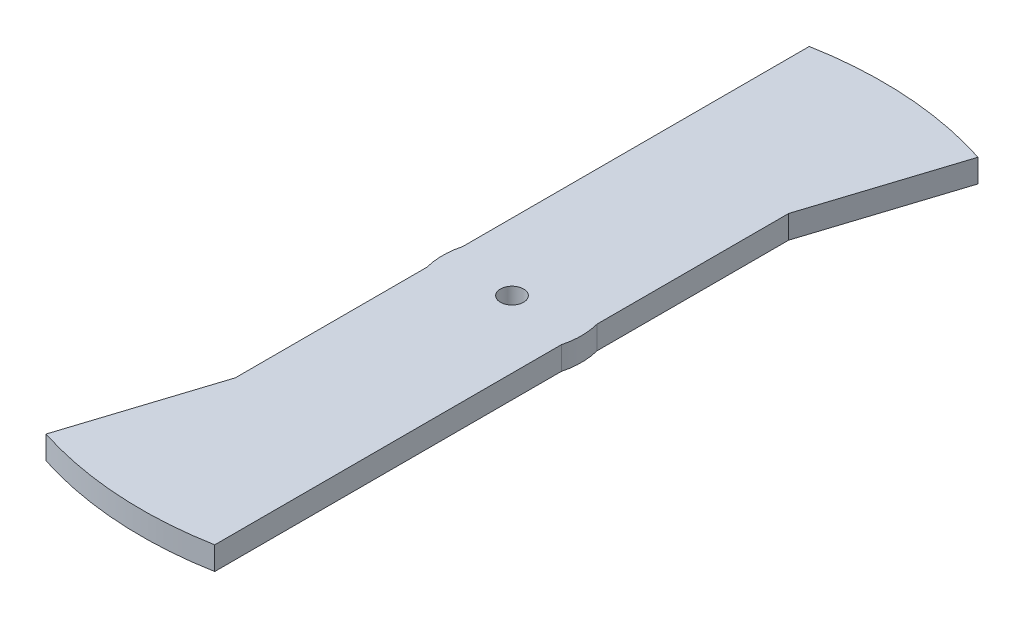
ISO-10303-21;
HEADER;
FILE_DESCRIPTION(('STEP AP214'),'2;1');
FILE_NAME('part.step','',(''),(''),'','','');
FILE_SCHEMA(('AUTOMOTIVE_DESIGN { 1 0 10303 214 1 1 1 1 }'));
ENDSEC;
DATA;
#1=APPLICATION_CONTEXT('core data for automotive mechanical design processes');
#2=APPLICATION_PROTOCOL_DEFINITION('international standard','automotive_design',2000,#1);
#3=PRODUCT_CONTEXT('',#1,'mechanical');
#4=PRODUCT('Part','Part','',(#3));
#5=PRODUCT_RELATED_PRODUCT_CATEGORY('part','',(#4));
#6=PRODUCT_DEFINITION_FORMATION('','',#4);
#7=PRODUCT_DEFINITION_CONTEXT('part definition',#1,'design');
#8=PRODUCT_DEFINITION('design','',#6,#7);
#9=PRODUCT_DEFINITION_SHAPE('','',#8);
#10=(LENGTH_UNIT() NAMED_UNIT(*) SI_UNIT(.MILLI.,.METRE.));
#11=(NAMED_UNIT(*) PLANE_ANGLE_UNIT() SI_UNIT($,.RADIAN.));
#12=(NAMED_UNIT(*) SI_UNIT($,.STERADIAN.) SOLID_ANGLE_UNIT());
#13=UNCERTAINTY_MEASURE_WITH_UNIT(LENGTH_MEASURE(1.E-05),#10,'distance_accuracy_value','');
#14=(GEOMETRIC_REPRESENTATION_CONTEXT(3) GLOBAL_UNCERTAINTY_ASSIGNED_CONTEXT((#13)) GLOBAL_UNIT_ASSIGNED_CONTEXT((#10,
#11,#12)) REPRESENTATION_CONTEXT('',''));
#15=CARTESIAN_POINT('',(0.,0.,0.));
#16=DIRECTION('',(0.,0.,1.));
#17=DIRECTION('',(1.,0.,0.));
#18=AXIS2_PLACEMENT_3D('',#15,#16,#17);
#19=CARTESIAN_POINT('',(0.,6.35,0.));
#20=DIRECTION('',(0.,-1.,0.));
#21=DIRECTION('',(0.,0.,-1.));
#22=AXIS2_PLACEMENT_3D('',#19,#20,#21);
#23=CYLINDRICAL_SURFACE('',#22,19.05);
#24=CARTESIAN_POINT('',(0.,0.,0.));
#25=DIRECTION('',(0.,1.,0.));
#26=DIRECTION('',(0.,0.,1.));
#27=AXIS2_PLACEMENT_3D('',#24,#25,#26);
#28=CIRCLE('',#27,19.05);
#29=CARTESIAN_POINT('',(18.415,0.,-4.87752754989657));
#30=VERTEX_POINT('',#29);
#31=CARTESIAN_POINT('',(18.415,0.,4.87752754989658));
#32=VERTEX_POINT('',#31);
#33=EDGE_CURVE('E145',#30,#32,#28,.F.);
#34=ORIENTED_EDGE('',*,*,#33,.F.);
#35=DIRECTION('',(0.,-1.,0.));
#36=VECTOR('',#35,1.);
#37=CARTESIAN_POINT('',(18.415,6.35,-4.87752754989657));
#38=LINE('',#37,#36);
#39=CARTESIAN_POINT('',(18.415,6.35,-4.87752754989657));
#40=VERTEX_POINT('',#39);
#41=EDGE_CURVE('E11',#40,#30,#38,.T.);
#42=ORIENTED_EDGE('',*,*,#41,.F.);
#43=CARTESIAN_POINT('',(0.,6.35,0.));
#44=DIRECTION('',(0.,1.,0.));
#45=DIRECTION('',(0.,0.,1.));
#46=AXIS2_PLACEMENT_3D('',#43,#44,#45);
#47=CIRCLE('',#46,19.05);
#48=CARTESIAN_POINT('',(18.415,6.35,4.87752754989658));
#49=VERTEX_POINT('',#48);
#50=EDGE_CURVE('E170',#40,#49,#47,.F.);
#51=ORIENTED_EDGE('',*,*,#50,.T.);
#52=DIRECTION('',(0.,-1.,0.));
#53=VECTOR('',#52,1.);
#54=CARTESIAN_POINT('',(18.415,6.35,4.87752754989658));
#55=LINE('',#54,#53);
#56=EDGE_CURVE('E91',#49,#32,#55,.T.);
#57=ORIENTED_EDGE('',*,*,#56,.T.);
#58=EDGE_LOOP('',(#34,#42,#51,#57));
#59=FACE_BOUND('',#58,.T.);
#60=ADVANCED_FACE('F35',(#59),#23,.T.);
#61=CARTESIAN_POINT('',(18.415,6.35,0.));
#62=DIRECTION('',(-1.,0.,0.));
#63=DIRECTION('',(0.,0.,1.));
#64=AXIS2_PLACEMENT_3D('',#61,#62,#63);
#65=PLANE('',#64);
#66=DIRECTION('',(0.,0.,-1.));
#67=VECTOR('',#66,1.);
#68=CARTESIAN_POINT('',(18.415,0.,0.));
#69=LINE('',#68,#67);
#70=CARTESIAN_POINT('',(18.415,0.,-57.4455690197251));
#71=VERTEX_POINT('',#70);
#72=EDGE_CURVE('E148',#30,#71,#69,.T.);
#73=ORIENTED_EDGE('',*,*,#72,.T.);
#74=DIRECTION('',(0.,-1.,0.));
#75=VECTOR('',#74,1.);
#76=CARTESIAN_POINT('',(18.415,6.35,-57.4455690197251));
#77=LINE('',#76,#75);
#78=CARTESIAN_POINT('',(18.415,6.35,-57.4455690197251));
#79=VERTEX_POINT('',#78);
#80=EDGE_CURVE('E43',#79,#71,#77,.T.);
#81=ORIENTED_EDGE('',*,*,#80,.F.);
#82=DIRECTION('',(0.,0.,-1.));
#83=VECTOR('',#82,1.);
#84=CARTESIAN_POINT('',(18.415,6.35,0.));
#85=LINE('',#84,#83);
#86=EDGE_CURVE('E209',#40,#79,#85,.T.);
#87=ORIENTED_EDGE('',*,*,#86,.F.);
#88=ORIENTED_EDGE('',*,*,#41,.T.);
#89=EDGE_LOOP('',(#73,#81,#87,#88));
#90=FACE_BOUND('',#89,.T.);
#91=ADVANCED_FACE('F223',(#90),#65,.F.);
#92=CARTESIAN_POINT('',(0.,6.35,0.));
#93=DIRECTION('',(-0.952268031823043,0.,-0.305263157894737));
#94=DIRECTION('',(-0.305263157894737,0.,0.952268031823044));
#95=AXIS2_PLACEMENT_3D('',#92,#93,#94);
#96=PLANE('',#95);
#97=DIRECTION('',(0.305263157894737,0.,-0.952268031823044));
#98=VECTOR('',#97,1.);
#99=CARTESIAN_POINT('',(0.,0.,0.));
#100=LINE('',#99,#98);
#101=CARTESIAN_POINT('',(31.0147368421053,0.,-96.7504320332212));
#102=VERTEX_POINT('',#101);
#103=EDGE_CURVE('E150',#71,#102,#100,.T.);
#104=ORIENTED_EDGE('',*,*,#103,.T.);
#105=DIRECTION('',(0.,-1.,0.));
#106=VECTOR('',#105,1.);
#107=CARTESIAN_POINT('',(31.0147368421053,6.35,-96.7504320332212));
#108=LINE('',#107,#106);
#109=CARTESIAN_POINT('',(31.0147368421053,6.35,-96.7504320332212));
#110=VERTEX_POINT('',#109);
#111=EDGE_CURVE('E182',#110,#102,#108,.T.);
#112=ORIENTED_EDGE('',*,*,#111,.F.);
#113=DIRECTION('',(0.305263157894737,0.,-0.952268031823044));
#114=VECTOR('',#113,1.);
#115=CARTESIAN_POINT('',(0.,6.35,0.));
#116=LINE('',#115,#114);
#117=EDGE_CURVE('E190',#79,#110,#116,.T.);
#118=ORIENTED_EDGE('',*,*,#117,.F.);
#119=ORIENTED_EDGE('',*,*,#80,.T.);
#120=EDGE_LOOP('',(#104,#112,#118,#119));
#121=FACE_BOUND('',#120,.T.);
#122=ADVANCED_FACE('F188',(#121),#96,.F.);
#123=CARTESIAN_POINT('',(0.,6.35,0.));
#124=DIRECTION('',(0.,-1.,0.));
#125=DIRECTION('',(0.,0.,-1.));
#126=AXIS2_PLACEMENT_3D('',#123,#124,#125);
#127=CYLINDRICAL_SURFACE('',#126,101.6);
#128=CARTESIAN_POINT('',(0.,0.,0.));
#129=DIRECTION('',(0.,1.,0.));
#130=DIRECTION('',(0.,0.,1.));
#131=AXIS2_PLACEMENT_3D('',#128,#129,#130);
#132=CIRCLE('',#131,101.6);
#133=CARTESIAN_POINT('',(-18.415,0.,-99.9172045996084));
#134=VERTEX_POINT('',#133);
#135=EDGE_CURVE('E153',#134,#102,#132,.F.);
#136=ORIENTED_EDGE('',*,*,#135,.F.);
#137=DIRECTION('',(0.,-1.,0.));
#138=VECTOR('',#137,1.);
#139=CARTESIAN_POINT('',(-18.415,6.35,-99.9172045996084));
#140=LINE('',#139,#138);
#141=CARTESIAN_POINT('',(-18.415,6.35,-99.9172045996084));
#142=VERTEX_POINT('',#141);
#143=EDGE_CURVE('E180',#142,#134,#140,.T.);
#144=ORIENTED_EDGE('',*,*,#143,.F.);
#145=CARTESIAN_POINT('',(0.,6.35,0.));
#146=DIRECTION('',(0.,1.,0.));
#147=DIRECTION('',(0.,0.,1.));
#148=AXIS2_PLACEMENT_3D('',#145,#146,#147);
#149=CIRCLE('',#148,101.6);
#150=EDGE_CURVE('E204',#142,#110,#149,.F.);
#151=ORIENTED_EDGE('',*,*,#150,.T.);
#152=ORIENTED_EDGE('',*,*,#111,.T.);
#153=EDGE_LOOP('',(#136,#144,#151,#152));
#154=FACE_BOUND('',#153,.T.);
#155=ADVANCED_FACE('F200',(#154),#127,.T.);
#156=CARTESIAN_POINT('',(-18.415,6.35,0.));
#157=DIRECTION('',(1.,0.,0.));
#158=DIRECTION('',(0.,0.,-1.));
#159=AXIS2_PLACEMENT_3D('',#156,#157,#158);
#160=PLANE('',#159);
#161=DIRECTION('',(0.,0.,1.));
#162=VECTOR('',#161,1.);
#163=CARTESIAN_POINT('',(-18.415,0.,0.));
#164=LINE('',#163,#162);
#165=CARTESIAN_POINT('',(-18.415,0.,-4.87752754989657));
#166=VERTEX_POINT('',#165);
#167=EDGE_CURVE('E156',#134,#166,#164,.T.);
#168=ORIENTED_EDGE('',*,*,#167,.T.);
#169=DIRECTION('',(0.,-1.,0.));
#170=VECTOR('',#169,1.);
#171=CARTESIAN_POINT('',(-18.415,6.35,-4.87752754989657));
#172=LINE('',#171,#170);
#173=CARTESIAN_POINT('',(-18.415,6.35,-4.87752754989657));
#174=VERTEX_POINT('',#173);
#175=EDGE_CURVE('E177',#174,#166,#172,.T.);
#176=ORIENTED_EDGE('',*,*,#175,.F.);
#177=DIRECTION('',(0.,0.,1.));
#178=VECTOR('',#177,1.);
#179=CARTESIAN_POINT('',(-18.415,6.35,0.));
#180=LINE('',#179,#178);
#181=EDGE_CURVE('E205',#142,#174,#180,.T.);
#182=ORIENTED_EDGE('',*,*,#181,.F.);
#183=ORIENTED_EDGE('',*,*,#143,.T.);
#184=EDGE_LOOP('',(#168,#176,#182,#183));
#185=FACE_BOUND('',#184,.T.);
#186=ADVANCED_FACE('F233',(#185),#160,.F.);
#187=CARTESIAN_POINT('',(0.,6.35,0.));
#188=DIRECTION('',(0.,-1.,0.));
#189=DIRECTION('',(0.,0.,-1.));
#190=AXIS2_PLACEMENT_3D('',#187,#188,#189);
#191=CYLINDRICAL_SURFACE('',#190,19.05);
#192=CARTESIAN_POINT('',(0.,0.,0.));
#193=DIRECTION('',(0.,1.,0.));
#194=DIRECTION('',(0.,0.,1.));
#195=AXIS2_PLACEMENT_3D('',#192,#193,#194);
#196=CIRCLE('',#195,19.05);
#197=CARTESIAN_POINT('',(-18.415,0.,4.87752754989657));
#198=VERTEX_POINT('',#197);
#199=EDGE_CURVE('E158',#166,#198,#196,.T.);
#200=ORIENTED_EDGE('',*,*,#199,.T.);
#201=DIRECTION('',(0.,-1.,0.));
#202=VECTOR('',#201,1.);
#203=CARTESIAN_POINT('',(-18.415,6.35,4.87752754989657));
#204=LINE('',#203,#202);
#205=CARTESIAN_POINT('',(-18.415,6.35,4.87752754989657));
#206=VERTEX_POINT('',#205);
#207=EDGE_CURVE('E174',#206,#198,#204,.T.);
#208=ORIENTED_EDGE('',*,*,#207,.F.);
#209=CARTESIAN_POINT('',(0.,6.35,0.));
#210=DIRECTION('',(0.,1.,0.));
#211=DIRECTION('',(0.,0.,1.));
#212=AXIS2_PLACEMENT_3D('',#209,#210,#211);
#213=CIRCLE('',#212,19.05);
#214=EDGE_CURVE('E207',#174,#206,#213,.T.);
#215=ORIENTED_EDGE('',*,*,#214,.F.);
#216=ORIENTED_EDGE('',*,*,#175,.T.);
#217=EDGE_LOOP('',(#200,#208,#215,#216));
#218=FACE_BOUND('',#217,.T.);
#219=ADVANCED_FACE('F217',(#218),#191,.T.);
#220=CARTESIAN_POINT('',(-18.415,6.35,0.));
#221=DIRECTION('',(1.,0.,0.));
#222=DIRECTION('',(0.,0.,-1.));
#223=AXIS2_PLACEMENT_3D('',#220,#221,#222);
#224=PLANE('',#223);
#225=DIRECTION('',(0.,0.,1.));
#226=VECTOR('',#225,1.);
#227=CARTESIAN_POINT('',(-18.415,0.,0.));
#228=LINE('',#227,#226);
#229=CARTESIAN_POINT('',(-18.415,0.,57.4455690197251));
#230=VERTEX_POINT('',#229);
#231=EDGE_CURVE('E160',#198,#230,#228,.T.);
#232=ORIENTED_EDGE('',*,*,#231,.T.);
#233=DIRECTION('',(0.,-1.,0.));
#234=VECTOR('',#233,1.);
#235=CARTESIAN_POINT('',(-18.415,6.35,57.4455690197251));
#236=LINE('',#235,#234);
#237=CARTESIAN_POINT('',(-18.415,6.35,57.4455690197251));
#238=VERTEX_POINT('',#237);
#239=EDGE_CURVE('E135',#238,#230,#236,.T.);
#240=ORIENTED_EDGE('',*,*,#239,.F.);
#241=DIRECTION('',(0.,0.,1.));
#242=VECTOR('',#241,1.);
#243=CARTESIAN_POINT('',(-18.415,6.35,0.));
#244=LINE('',#243,#242);
#245=EDGE_CURVE('E122',#206,#238,#244,.T.);
#246=ORIENTED_EDGE('',*,*,#245,.F.);
#247=ORIENTED_EDGE('',*,*,#207,.T.);
#248=EDGE_LOOP('',(#232,#240,#246,#247));
#249=FACE_BOUND('',#248,.T.);
#250=ADVANCED_FACE('F220',(#249),#224,.F.);
#251=CARTESIAN_POINT('',(0.,6.35,0.));
#252=DIRECTION('',(0.952268031823043,0.,0.305263157894737));
#253=DIRECTION('',(0.305263157894737,0.,-0.952268031823043));
#254=AXIS2_PLACEMENT_3D('',#251,#252,#253);
#255=PLANE('',#254);
#256=DIRECTION('',(-0.305263157894737,0.,0.952268031823043));
#257=VECTOR('',#256,1.);
#258=CARTESIAN_POINT('',(0.,0.,0.));
#259=LINE('',#258,#257);
#260=CARTESIAN_POINT('',(-31.0147368421053,0.,96.7504320332212));
#261=VERTEX_POINT('',#260);
#262=EDGE_CURVE('E131',#230,#261,#259,.T.);
#263=ORIENTED_EDGE('',*,*,#262,.T.);
#264=DIRECTION('',(0.,-1.,0.));
#265=VECTOR('',#264,1.);
#266=CARTESIAN_POINT('',(-31.0147368421053,6.35,96.7504320332212));
#267=LINE('',#266,#265);
#268=CARTESIAN_POINT('',(-31.0147368421053,6.35,96.7504320332212));
#269=VERTEX_POINT('',#268);
#270=EDGE_CURVE('E128',#269,#261,#267,.T.);
#271=ORIENTED_EDGE('',*,*,#270,.F.);
#272=DIRECTION('',(-0.305263157894737,0.,0.952268031823043));
#273=VECTOR('',#272,1.);
#274=CARTESIAN_POINT('',(0.,6.35,0.));
#275=LINE('',#274,#273);
#276=EDGE_CURVE('E115',#238,#269,#275,.T.);
#277=ORIENTED_EDGE('',*,*,#276,.F.);
#278=ORIENTED_EDGE('',*,*,#239,.T.);
#279=EDGE_LOOP('',(#263,#271,#277,#278));
#280=FACE_BOUND('',#279,.T.);
#281=ADVANCED_FACE('F129',(#280),#255,.F.);
#282=CARTESIAN_POINT('',(0.,6.35,0.));
#283=DIRECTION('',(0.,-1.,0.));
#284=DIRECTION('',(0.,0.,-1.));
#285=AXIS2_PLACEMENT_3D('',#282,#283,#284);
#286=CYLINDRICAL_SURFACE('',#285,101.6);
#287=CARTESIAN_POINT('',(0.,0.,0.));
#288=DIRECTION('',(0.,1.,0.));
#289=DIRECTION('',(0.,0.,1.));
#290=AXIS2_PLACEMENT_3D('',#287,#288,#289);
#291=CIRCLE('',#290,101.6);
#292=CARTESIAN_POINT('',(18.4149999999999,0.,99.9172045996084));
#293=VERTEX_POINT('',#292);
#294=EDGE_CURVE('E163',#293,#261,#291,.F.);
#295=ORIENTED_EDGE('',*,*,#294,.F.);
#296=DIRECTION('',(0.,-1.,0.));
#297=VECTOR('',#296,1.);
#298=CARTESIAN_POINT('',(18.4149999999999,6.35,99.9172045996084));
#299=LINE('',#298,#297);
#300=CARTESIAN_POINT('',(18.4149999999999,6.35,99.9172045996084));
#301=VERTEX_POINT('',#300);
#302=EDGE_CURVE('E84',#301,#293,#299,.T.);
#303=ORIENTED_EDGE('',*,*,#302,.F.);
#304=CARTESIAN_POINT('',(0.,6.35,0.));
#305=DIRECTION('',(0.,1.,0.));
#306=DIRECTION('',(0.,0.,1.));
#307=AXIS2_PLACEMENT_3D('',#304,#305,#306);
#308=CIRCLE('',#307,101.6);
#309=EDGE_CURVE('E120',#301,#269,#308,.F.);
#310=ORIENTED_EDGE('',*,*,#309,.T.);
#311=ORIENTED_EDGE('',*,*,#270,.T.);
#312=EDGE_LOOP('',(#295,#303,#310,#311));
#313=FACE_BOUND('',#312,.T.);
#314=ADVANCED_FACE('F137',(#313),#286,.T.);
#315=CARTESIAN_POINT('',(18.415,6.35,0.));
#316=DIRECTION('',(-1.,0.,0.));
#317=DIRECTION('',(0.,0.,1.));
#318=AXIS2_PLACEMENT_3D('',#315,#316,#317);
#319=PLANE('',#318);
#320=DIRECTION('',(0.,0.,-1.));
#321=VECTOR('',#320,1.);
#322=CARTESIAN_POINT('',(18.415,0.,0.));
#323=LINE('',#322,#321);
#324=EDGE_CURVE('E165',#293,#32,#323,.T.);
#325=ORIENTED_EDGE('',*,*,#324,.T.);
#326=ORIENTED_EDGE('',*,*,#56,.F.);
#327=DIRECTION('',(0.,0.,-1.));
#328=VECTOR('',#327,1.);
#329=CARTESIAN_POINT('',(18.415,6.35,0.));
#330=LINE('',#329,#328);
#331=EDGE_CURVE('E51',#301,#49,#330,.T.);
#332=ORIENTED_EDGE('',*,*,#331,.F.);
#333=ORIENTED_EDGE('',*,*,#302,.T.);
#334=EDGE_LOOP('',(#325,#326,#332,#333));
#335=FACE_BOUND('',#334,.T.);
#336=ADVANCED_FACE('F221',(#335),#319,.F.);
#337=CARTESIAN_POINT('',(0.,6.35,0.));
#338=DIRECTION('',(0.,-1.,0.));
#339=DIRECTION('',(0.,0.,-1.));
#340=AXIS2_PLACEMENT_3D('',#337,#338,#339);
#341=CYLINDRICAL_SURFACE('',#340,3.175);
#342=CARTESIAN_POINT('',(0.,6.35,0.));
#343=DIRECTION('',(0.,1.,0.));
#344=DIRECTION('',(0.,0.,1.));
#345=AXIS2_PLACEMENT_3D('',#342,#343,#344);
#346=CIRCLE('',#345,3.175);
#347=CARTESIAN_POINT('',(0.,6.35,3.175));
#348=VERTEX_POINT('',#347);
#349=EDGE_CURVE('E139',#348,#348,#346,.T.);
#350=ORIENTED_EDGE('',*,*,#349,.T.);
#351=EDGE_LOOP('',(#350));
#352=FACE_BOUND('',#351,.T.);
#353=CARTESIAN_POINT('',(0.,0.,0.));
#354=DIRECTION('',(0.,1.,0.));
#355=DIRECTION('',(0.,0.,1.));
#356=AXIS2_PLACEMENT_3D('',#353,#354,#355);
#357=CIRCLE('',#356,3.175);
#358=CARTESIAN_POINT('',(0.,0.,3.175));
#359=VERTEX_POINT('',#358);
#360=EDGE_CURVE('E167',#359,#359,#357,.T.);
#361=ORIENTED_EDGE('',*,*,#360,.F.);
#362=EDGE_LOOP('',(#361));
#363=FACE_BOUND('',#362,.T.);
#364=ADVANCED_FACE('F247',(#352,#363),#341,.F.);
#365=CARTESIAN_POINT('',(0.,6.35,0.));
#366=DIRECTION('',(0.,1.,0.));
#367=DIRECTION('',(0.,0.,1.));
#368=AXIS2_PLACEMENT_3D('',#365,#366,#367);
#369=PLANE('',#368);
#370=ORIENTED_EDGE('',*,*,#50,.F.);
#371=ORIENTED_EDGE('',*,*,#86,.T.);
#372=ORIENTED_EDGE('',*,*,#117,.T.);
#373=ORIENTED_EDGE('',*,*,#150,.F.);
#374=ORIENTED_EDGE('',*,*,#181,.T.);
#375=ORIENTED_EDGE('',*,*,#214,.T.);
#376=ORIENTED_EDGE('',*,*,#245,.T.);
#377=ORIENTED_EDGE('',*,*,#276,.T.);
#378=ORIENTED_EDGE('',*,*,#309,.F.);
#379=ORIENTED_EDGE('',*,*,#331,.T.);
#380=EDGE_LOOP('',(#370,#371,#372,#373,#374,#375,#376,#377,#378,#379));
#381=FACE_BOUND('',#380,.T.);
#382=ORIENTED_EDGE('',*,*,#349,.F.);
#383=EDGE_LOOP('',(#382));
#384=FACE_BOUND('',#383,.T.);
#385=ADVANCED_FACE('F117',(#381,#384),#369,.T.);
#386=CARTESIAN_POINT('',(0.,0.,0.));
#387=DIRECTION('',(0.,1.,0.));
#388=DIRECTION('',(0.,0.,1.));
#389=AXIS2_PLACEMENT_3D('',#386,#387,#388);
#390=PLANE('',#389);
#391=ORIENTED_EDGE('',*,*,#33,.T.);
#392=ORIENTED_EDGE('',*,*,#324,.F.);
#393=ORIENTED_EDGE('',*,*,#294,.T.);
#394=ORIENTED_EDGE('',*,*,#262,.F.);
#395=ORIENTED_EDGE('',*,*,#231,.F.);
#396=ORIENTED_EDGE('',*,*,#199,.F.);
#397=ORIENTED_EDGE('',*,*,#167,.F.);
#398=ORIENTED_EDGE('',*,*,#135,.T.);
#399=ORIENTED_EDGE('',*,*,#103,.F.);
#400=ORIENTED_EDGE('',*,*,#72,.F.);
#401=EDGE_LOOP('',(#391,#392,#393,#394,#395,#396,#397,#398,#399,#400));
#402=FACE_BOUND('',#401,.T.);
#403=ORIENTED_EDGE('',*,*,#360,.T.);
#404=EDGE_LOOP('',(#403));
#405=FACE_BOUND('',#404,.T.);
#406=ADVANCED_FACE('F194',(#402,#405),#390,.F.);
#407=CLOSED_SHELL('',(#60,#91,#122,#155,#186,#219,#250,#281,#314,#336,#364,#385,#406));
#408=MANIFOLD_SOLID_BREP('B2',#407);
#409=ADVANCED_BREP_SHAPE_REPRESENTATION('',(#18,#408),#14);
#410=SHAPE_DEFINITION_REPRESENTATION(#9,#409);
ENDSEC;
END-ISO-10303-21;
